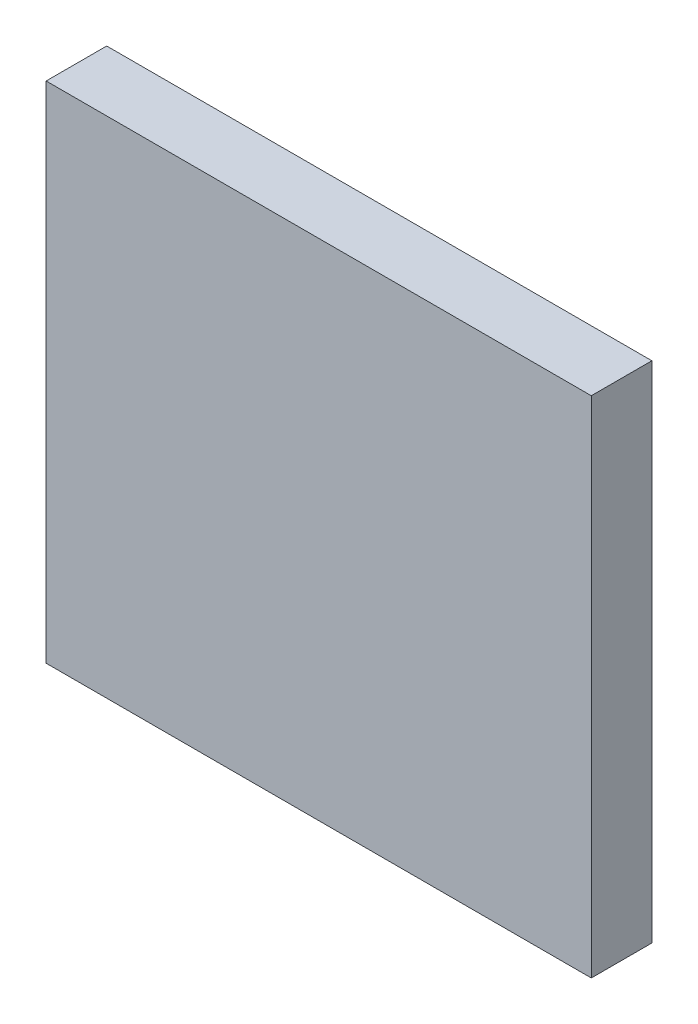
ISO-10303-21;
HEADER;
FILE_DESCRIPTION(('STEP AP214'),'2;1');
FILE_NAME('part.step','',(''),(''),'','','');
FILE_SCHEMA(('AUTOMOTIVE_DESIGN { 1 0 10303 214 1 1 1 1 }'));
ENDSEC;
DATA;
#1=APPLICATION_CONTEXT('core data for automotive mechanical design processes');
#2=APPLICATION_PROTOCOL_DEFINITION('international standard','automotive_design',2000,#1);
#3=PRODUCT_CONTEXT('',#1,'mechanical');
#4=PRODUCT('Part','Part','',(#3));
#5=PRODUCT_RELATED_PRODUCT_CATEGORY('part','',(#4));
#6=PRODUCT_DEFINITION_FORMATION('','',#4);
#7=PRODUCT_DEFINITION_CONTEXT('part definition',#1,'design');
#8=PRODUCT_DEFINITION('design','',#6,#7);
#9=PRODUCT_DEFINITION_SHAPE('','',#8);
#10=(LENGTH_UNIT() NAMED_UNIT(*) SI_UNIT(.MILLI.,.METRE.));
#11=(NAMED_UNIT(*) PLANE_ANGLE_UNIT() SI_UNIT($,.RADIAN.));
#12=(NAMED_UNIT(*) SI_UNIT($,.STERADIAN.) SOLID_ANGLE_UNIT());
#13=UNCERTAINTY_MEASURE_WITH_UNIT(LENGTH_MEASURE(1.E-05),#10,'distance_accuracy_value','');
#14=(GEOMETRIC_REPRESENTATION_CONTEXT(3) GLOBAL_UNCERTAINTY_ASSIGNED_CONTEXT((#13)) GLOBAL_UNIT_ASSIGNED_CONTEXT((#10,
#11,#12)) REPRESENTATION_CONTEXT('',''));
#15=CARTESIAN_POINT('',(0.,0.,0.));
#16=DIRECTION('',(0.,0.,1.));
#17=DIRECTION('',(1.,0.,0.));
#18=AXIS2_PLACEMENT_3D('',#15,#16,#17);
#19=CARTESIAN_POINT('',(-4.5,4.1625,1.));
#20=DIRECTION('',(0.,0.,1.));
#21=DIRECTION('',(1.,0.,0.));
#22=AXIS2_PLACEMENT_3D('',#19,#20,#21);
#23=PLANE('',#22);
#24=DIRECTION('',(0.,1.,0.));
#25=VECTOR('',#24,1.);
#26=CARTESIAN_POINT('',(4.5,4.1625,1.));
#27=LINE('',#26,#25);
#28=CARTESIAN_POINT('',(4.5,4.1625,1.));
#29=VERTEX_POINT('',#28);
#30=CARTESIAN_POINT('',(4.5,-4.1625,1.));
#31=VERTEX_POINT('',#30);
#32=EDGE_CURVE('E53',#29,#31,#27,.F.);
#33=ORIENTED_EDGE('',*,*,#32,.F.);
#34=DIRECTION('',(1.,0.,0.));
#35=VECTOR('',#34,1.);
#36=CARTESIAN_POINT('',(-4.5,4.1625,1.));
#37=LINE('',#36,#35);
#38=CARTESIAN_POINT('',(-4.5,4.1625,1.));
#39=VERTEX_POINT('',#38);
#40=EDGE_CURVE('E68',#39,#29,#37,.T.);
#41=ORIENTED_EDGE('',*,*,#40,.F.);
#42=DIRECTION('',(0.,1.,0.));
#43=VECTOR('',#42,1.);
#44=CARTESIAN_POINT('',(-4.5,-4.1625,1.));
#45=LINE('',#44,#43);
#46=CARTESIAN_POINT('',(-4.5,-4.1625,1.));
#47=VERTEX_POINT('',#46);
#48=EDGE_CURVE('E20',#47,#39,#45,.T.);
#49=ORIENTED_EDGE('',*,*,#48,.F.);
#50=DIRECTION('',(1.,0.,0.));
#51=VECTOR('',#50,1.);
#52=CARTESIAN_POINT('',(4.5,-4.1625,1.));
#53=LINE('',#52,#51);
#54=EDGE_CURVE('E58',#31,#47,#53,.F.);
#55=ORIENTED_EDGE('',*,*,#54,.F.);
#56=EDGE_LOOP('',(#33,#41,#49,#55));
#57=FACE_BOUND('',#56,.T.);
#58=ADVANCED_FACE('F17',(#57),#23,.T.);
#59=CARTESIAN_POINT('',(-4.5,-4.1625,0.));
#60=DIRECTION('',(-1.,0.,0.));
#61=DIRECTION('',(0.,0.,1.));
#62=AXIS2_PLACEMENT_3D('',#59,#60,#61);
#63=PLANE('',#62);
#64=DIRECTION('',(0.,0.,1.));
#65=VECTOR('',#64,1.);
#66=CARTESIAN_POINT('',(-4.5,4.1625,0.));
#67=LINE('',#66,#65);
#68=CARTESIAN_POINT('',(-4.5,4.1625,0.));
#69=VERTEX_POINT('',#68);
#70=EDGE_CURVE('E79',#69,#39,#67,.T.);
#71=ORIENTED_EDGE('',*,*,#70,.F.);
#72=DIRECTION('',(0.,1.,0.));
#73=VECTOR('',#72,1.);
#74=CARTESIAN_POINT('',(-4.5,4.1625,0.));
#75=LINE('',#74,#73);
#76=CARTESIAN_POINT('',(-4.5,-4.1625,0.));
#77=VERTEX_POINT('',#76);
#78=EDGE_CURVE('E74',#69,#77,#75,.F.);
#79=ORIENTED_EDGE('',*,*,#78,.T.);
#80=DIRECTION('',(0.,0.,-1.));
#81=VECTOR('',#80,1.);
#82=CARTESIAN_POINT('',(-4.5,-4.1625,0.));
#83=LINE('',#82,#81);
#84=EDGE_CURVE('E63',#47,#77,#83,.T.);
#85=ORIENTED_EDGE('',*,*,#84,.F.);
#86=ORIENTED_EDGE('',*,*,#48,.T.);
#87=EDGE_LOOP('',(#71,#79,#85,#86));
#88=FACE_BOUND('',#87,.T.);
#89=ADVANCED_FACE('F73',(#88),#63,.T.);
#90=CARTESIAN_POINT('',(4.5,-4.1625,0.));
#91=DIRECTION('',(0.,-1.,0.));
#92=DIRECTION('',(0.,0.,-1.));
#93=AXIS2_PLACEMENT_3D('',#90,#91,#92);
#94=PLANE('',#93);
#95=ORIENTED_EDGE('',*,*,#84,.T.);
#96=DIRECTION('',(1.,0.,0.));
#97=VECTOR('',#96,1.);
#98=CARTESIAN_POINT('',(-4.5,-4.1625,0.));
#99=LINE('',#98,#97);
#100=CARTESIAN_POINT('',(4.5,-4.1625,0.));
#101=VERTEX_POINT('',#100);
#102=EDGE_CURVE('E84',#77,#101,#99,.T.);
#103=ORIENTED_EDGE('',*,*,#102,.T.);
#104=DIRECTION('',(0.,0.,-1.));
#105=VECTOR('',#104,1.);
#106=CARTESIAN_POINT('',(4.5,-4.1625,0.));
#107=LINE('',#106,#105);
#108=EDGE_CURVE('E65',#31,#101,#107,.T.);
#109=ORIENTED_EDGE('',*,*,#108,.F.);
#110=ORIENTED_EDGE('',*,*,#54,.T.);
#111=EDGE_LOOP('',(#95,#103,#109,#110));
#112=FACE_BOUND('',#111,.T.);
#113=ADVANCED_FACE('F60',(#112),#94,.T.);
#114=CARTESIAN_POINT('',(4.5,4.1625,0.));
#115=DIRECTION('',(1.,0.,0.));
#116=DIRECTION('',(0.,0.,-1.));
#117=AXIS2_PLACEMENT_3D('',#114,#115,#116);
#118=PLANE('',#117);
#119=ORIENTED_EDGE('',*,*,#108,.T.);
#120=DIRECTION('',(0.,1.,0.));
#121=VECTOR('',#120,1.);
#122=CARTESIAN_POINT('',(4.5,4.1625,0.));
#123=LINE('',#122,#121);
#124=CARTESIAN_POINT('',(4.5,4.1625,0.));
#125=VERTEX_POINT('',#124);
#126=EDGE_CURVE('E26',#101,#125,#123,.T.);
#127=ORIENTED_EDGE('',*,*,#126,.T.);
#128=DIRECTION('',(0.,0.,1.));
#129=VECTOR('',#128,1.);
#130=CARTESIAN_POINT('',(4.5,4.1625,0.));
#131=LINE('',#130,#129);
#132=EDGE_CURVE('E34',#29,#125,#131,.F.);
#133=ORIENTED_EDGE('',*,*,#132,.F.);
#134=ORIENTED_EDGE('',*,*,#32,.T.);
#135=EDGE_LOOP('',(#119,#127,#133,#134));
#136=FACE_BOUND('',#135,.T.);
#137=ADVANCED_FACE('F88',(#136),#118,.T.);
#138=CARTESIAN_POINT('',(-4.5,4.1625,0.));
#139=DIRECTION('',(0.,1.,0.));
#140=DIRECTION('',(0.,0.,1.));
#141=AXIS2_PLACEMENT_3D('',#138,#139,#140);
#142=PLANE('',#141);
#143=ORIENTED_EDGE('',*,*,#132,.T.);
#144=DIRECTION('',(1.,0.,0.));
#145=VECTOR('',#144,1.);
#146=CARTESIAN_POINT('',(-4.5,4.1625,0.));
#147=LINE('',#146,#145);
#148=EDGE_CURVE('E11',#125,#69,#147,.F.);
#149=ORIENTED_EDGE('',*,*,#148,.T.);
#150=ORIENTED_EDGE('',*,*,#70,.T.);
#151=ORIENTED_EDGE('',*,*,#40,.T.);
#152=EDGE_LOOP('',(#143,#149,#150,#151));
#153=FACE_BOUND('',#152,.T.);
#154=ADVANCED_FACE('F91',(#153),#142,.T.);
#155=CARTESIAN_POINT('',(-4.5,4.1625,0.));
#156=DIRECTION('',(0.,0.,1.));
#157=DIRECTION('',(1.,0.,0.));
#158=AXIS2_PLACEMENT_3D('',#155,#156,#157);
#159=PLANE('',#158);
#160=ORIENTED_EDGE('',*,*,#126,.F.);
#161=ORIENTED_EDGE('',*,*,#102,.F.);
#162=ORIENTED_EDGE('',*,*,#78,.F.);
#163=ORIENTED_EDGE('',*,*,#148,.F.);
#164=EDGE_LOOP('',(#160,#161,#162,#163));
#165=FACE_BOUND('',#164,.T.);
#166=ADVANCED_FACE('F90',(#165),#159,.F.);
#167=CLOSED_SHELL('',(#58,#89,#113,#137,#154,#166));
#168=MANIFOLD_SOLID_BREP('B1',#167);
#169=ADVANCED_BREP_SHAPE_REPRESENTATION('',(#18,#168),#14);
#170=SHAPE_DEFINITION_REPRESENTATION(#9,#169);
ENDSEC;
END-ISO-10303-21;
